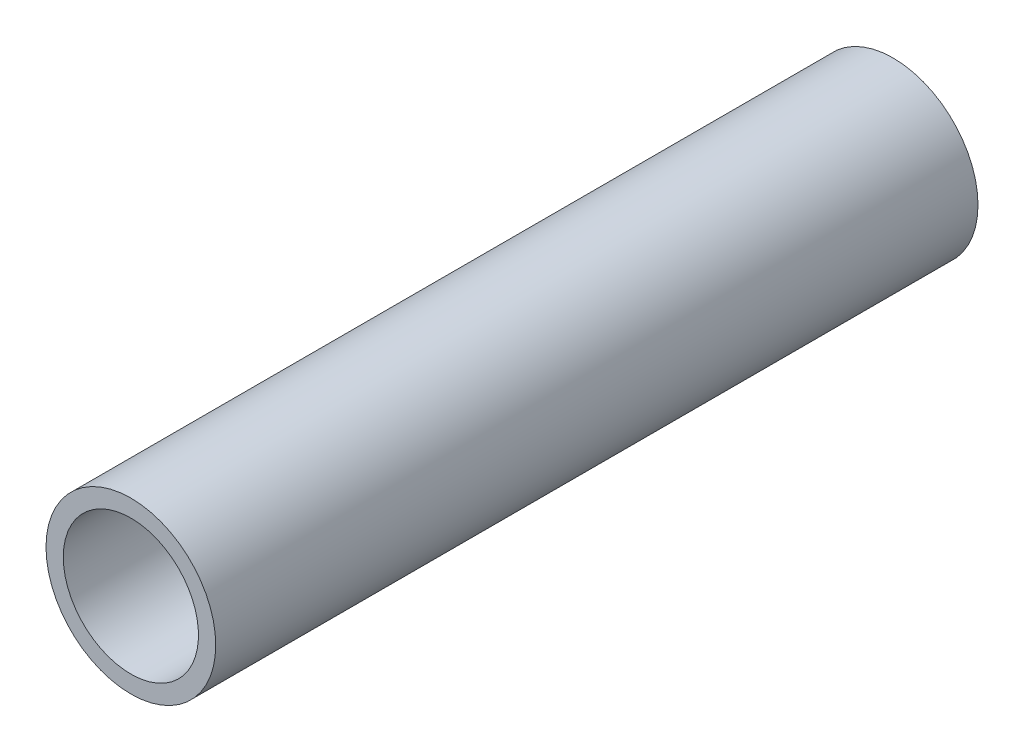
ISO-10303-21;
HEADER;
FILE_DESCRIPTION(('STEP AP214'),'2;1');
FILE_NAME('part.step','',(''),(''),'','','');
FILE_SCHEMA(('AUTOMOTIVE_DESIGN { 1 0 10303 214 1 1 1 1 }'));
ENDSEC;
DATA;
#1=APPLICATION_CONTEXT('core data for automotive mechanical design processes');
#2=APPLICATION_PROTOCOL_DEFINITION('international standard','automotive_design',2000,#1);
#3=PRODUCT_CONTEXT('',#1,'mechanical');
#4=PRODUCT('Part','Part','',(#3));
#5=PRODUCT_RELATED_PRODUCT_CATEGORY('part','',(#4));
#6=PRODUCT_DEFINITION_FORMATION('','',#4);
#7=PRODUCT_DEFINITION_CONTEXT('part definition',#1,'design');
#8=PRODUCT_DEFINITION('design','',#6,#7);
#9=PRODUCT_DEFINITION_SHAPE('','',#8);
#10=(LENGTH_UNIT() NAMED_UNIT(*) SI_UNIT(.MILLI.,.METRE.));
#11=(NAMED_UNIT(*) PLANE_ANGLE_UNIT() SI_UNIT($,.RADIAN.));
#12=(NAMED_UNIT(*) SI_UNIT($,.STERADIAN.) SOLID_ANGLE_UNIT());
#13=UNCERTAINTY_MEASURE_WITH_UNIT(LENGTH_MEASURE(1.E-05),#10,'distance_accuracy_value','');
#14=(GEOMETRIC_REPRESENTATION_CONTEXT(3) GLOBAL_UNCERTAINTY_ASSIGNED_CONTEXT((#13)) GLOBAL_UNIT_ASSIGNED_CONTEXT((#10,
#11,#12)) REPRESENTATION_CONTEXT('',''));
#15=CARTESIAN_POINT('',(0.,0.,0.));
#16=DIRECTION('',(0.,0.,1.));
#17=DIRECTION('',(1.,0.,0.));
#18=AXIS2_PLACEMENT_3D('',#15,#16,#17);
#19=CARTESIAN_POINT('',(0.,0.,150.));
#20=DIRECTION('',(0.,0.,-1.));
#21=DIRECTION('',(-1.,0.,0.));
#22=AXIS2_PLACEMENT_3D('',#19,#20,#21);
#23=CYLINDRICAL_SURFACE('',#22,16.7);
#24=CARTESIAN_POINT('',(0.,0.,150.));
#25=DIRECTION('',(0.,0.,1.));
#26=DIRECTION('',(1.,0.,0.));
#27=AXIS2_PLACEMENT_3D('',#24,#25,#26);
#28=CIRCLE('',#27,16.7);
#29=CARTESIAN_POINT('',(16.7,0.,150.));
#30=VERTEX_POINT('',#29);
#31=EDGE_CURVE('E10',#30,#30,#28,.T.);
#32=ORIENTED_EDGE('',*,*,#31,.F.);
#33=EDGE_LOOP('',(#32));
#34=FACE_BOUND('',#33,.T.);
#35=CARTESIAN_POINT('',(0.,0.,0.));
#36=DIRECTION('',(0.,0.,1.));
#37=DIRECTION('',(1.,0.,0.));
#38=AXIS2_PLACEMENT_3D('',#35,#36,#37);
#39=CIRCLE('',#38,16.7);
#40=CARTESIAN_POINT('',(16.7,0.,0.));
#41=VERTEX_POINT('',#40);
#42=EDGE_CURVE('E40',#41,#41,#39,.T.);
#43=ORIENTED_EDGE('',*,*,#42,.T.);
#44=EDGE_LOOP('',(#43));
#45=FACE_BOUND('',#44,.T.);
#46=ADVANCED_FACE('F37',(#34,#45),#23,.T.);
#47=CARTESIAN_POINT('',(0.,0.,150.));
#48=DIRECTION('',(0.,0.,1.));
#49=DIRECTION('',(1.,0.,0.));
#50=AXIS2_PLACEMENT_3D('',#47,#48,#49);
#51=PLANE('',#50);
#52=CARTESIAN_POINT('',(0.,0.,150.));
#53=DIRECTION('',(0.,0.,-1.));
#54=DIRECTION('',(-1.,0.,0.));
#55=AXIS2_PLACEMENT_3D('',#52,#53,#54);
#56=CIRCLE('',#55,13.3);
#57=CARTESIAN_POINT('',(-13.3,0.,150.));
#58=VERTEX_POINT('',#57);
#59=EDGE_CURVE('E47',#58,#58,#56,.T.);
#60=ORIENTED_EDGE('',*,*,#59,.T.);
#61=EDGE_LOOP('',(#60));
#62=FACE_BOUND('',#61,.T.);
#63=ORIENTED_EDGE('',*,*,#31,.T.);
#64=EDGE_LOOP('',(#63));
#65=FACE_BOUND('',#64,.T.);
#66=ADVANCED_FACE('F55',(#62,#65),#51,.T.);
#67=CARTESIAN_POINT('',(0.,0.,0.));
#68=DIRECTION('',(0.,0.,1.));
#69=DIRECTION('',(1.,0.,0.));
#70=AXIS2_PLACEMENT_3D('',#67,#68,#69);
#71=PLANE('',#70);
#72=CARTESIAN_POINT('',(0.,0.,0.));
#73=DIRECTION('',(0.,0.,-1.));
#74=DIRECTION('',(-1.,0.,0.));
#75=AXIS2_PLACEMENT_3D('',#72,#73,#74);
#76=CIRCLE('',#75,13.3);
#77=CARTESIAN_POINT('',(-13.3,0.,0.));
#78=VERTEX_POINT('',#77);
#79=EDGE_CURVE('E49',#78,#78,#76,.T.);
#80=ORIENTED_EDGE('',*,*,#79,.F.);
#81=EDGE_LOOP('',(#80));
#82=FACE_BOUND('',#81,.T.);
#83=ORIENTED_EDGE('',*,*,#42,.F.);
#84=EDGE_LOOP('',(#83));
#85=FACE_BOUND('',#84,.T.);
#86=ADVANCED_FACE('F60',(#82,#85),#71,.F.);
#87=CARTESIAN_POINT('',(0.,0.,150.));
#88=DIRECTION('',(0.,0.,-1.));
#89=DIRECTION('',(-1.,0.,0.));
#90=AXIS2_PLACEMENT_3D('',#87,#88,#89);
#91=CYLINDRICAL_SURFACE('',#90,13.3);
#92=ORIENTED_EDGE('',*,*,#59,.F.);
#93=EDGE_LOOP('',(#92));
#94=FACE_BOUND('',#93,.T.);
#95=ORIENTED_EDGE('',*,*,#79,.T.);
#96=EDGE_LOOP('',(#95));
#97=FACE_BOUND('',#96,.T.);
#98=ADVANCED_FACE('F57',(#94,#97),#91,.F.);
#99=CLOSED_SHELL('',(#46,#66,#86,#98));
#100=MANIFOLD_SOLID_BREP('B2',#99);
#101=ADVANCED_BREP_SHAPE_REPRESENTATION('',(#18,#100),#14);
#102=SHAPE_DEFINITION_REPRESENTATION(#9,#101);
ENDSEC;
END-ISO-10303-21;
